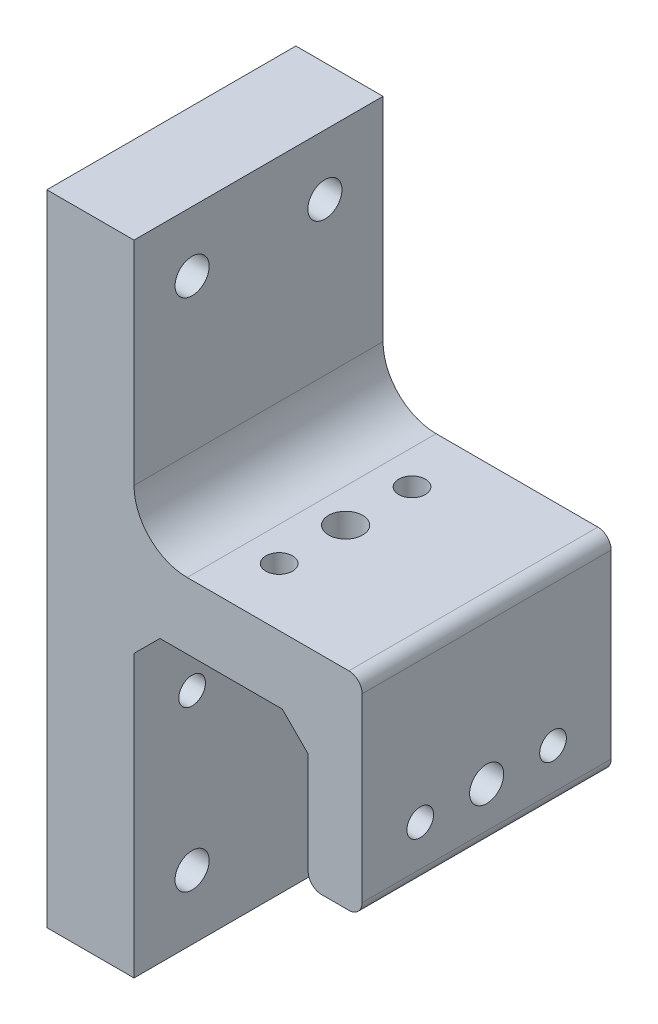
ISO-10303-21;
HEADER;
FILE_DESCRIPTION(('STEP AP214'),'2;1');
FILE_NAME('part.step','',(''),(''),'','','');
FILE_SCHEMA(('AUTOMOTIVE_DESIGN { 1 0 10303 214 1 1 1 1 }'));
ENDSEC;
DATA;
#1=APPLICATION_CONTEXT('core data for automotive mechanical design processes');
#2=APPLICATION_PROTOCOL_DEFINITION('international standard','automotive_design',2000,#1);
#3=PRODUCT_CONTEXT('',#1,'mechanical');
#4=PRODUCT('Part','Part','',(#3));
#5=PRODUCT_RELATED_PRODUCT_CATEGORY('part','',(#4));
#6=PRODUCT_DEFINITION_FORMATION('','',#4);
#7=PRODUCT_DEFINITION_CONTEXT('part definition',#1,'design');
#8=PRODUCT_DEFINITION('design','',#6,#7);
#9=PRODUCT_DEFINITION_SHAPE('','',#8);
#10=(LENGTH_UNIT() NAMED_UNIT(*) SI_UNIT(.MILLI.,.METRE.));
#11=(NAMED_UNIT(*) PLANE_ANGLE_UNIT() SI_UNIT($,.RADIAN.));
#12=(NAMED_UNIT(*) SI_UNIT($,.STERADIAN.) SOLID_ANGLE_UNIT());
#13=UNCERTAINTY_MEASURE_WITH_UNIT(LENGTH_MEASURE(1.E-05),#10,'distance_accuracy_value','');
#14=(GEOMETRIC_REPRESENTATION_CONTEXT(3) GLOBAL_UNCERTAINTY_ASSIGNED_CONTEXT((#13)) GLOBAL_UNIT_ASSIGNED_CONTEXT((#10,
#11,#12)) REPRESENTATION_CONTEXT('',''));
#15=CARTESIAN_POINT('',(0.,0.,0.));
#16=DIRECTION('',(0.,0.,1.));
#17=DIRECTION('',(1.,0.,0.));
#18=AXIS2_PLACEMENT_3D('',#15,#16,#17);
#19=CARTESIAN_POINT('',(0.,14.6812,0.));
#20=DIRECTION('',(0.,1.,0.));
#21=DIRECTION('',(-1.,0.,0.));
#22=AXIS2_PLACEMENT_3D('',#19,#20,#21);
#23=PLANE('',#22);
#24=CARTESIAN_POINT('',(0.,14.6812,-12.7));
#25=DIRECTION('',(0.,1.,0.));
#26=DIRECTION('',(-1.,0.,0.));
#27=AXIS2_PLACEMENT_3D('',#24,#25,#26);
#28=CIRCLE('',#27,2.5527);
#29=CARTESIAN_POINT('',(-2.5527,14.6812,-12.7));
#30=VERTEX_POINT('',#29);
#31=EDGE_CURVE('E269',#30,#30,#28,.T.);
#32=ORIENTED_EDGE('',*,*,#31,.F.);
#33=EDGE_LOOP('',(#32));
#34=FACE_BOUND('',#33,.T.);
#35=CARTESIAN_POINT('',(0.,14.6812,12.7));
#36=DIRECTION('',(0.,1.,0.));
#37=DIRECTION('',(-1.,0.,0.));
#38=AXIS2_PLACEMENT_3D('',#35,#36,#37);
#39=CIRCLE('',#38,2.5527);
#40=CARTESIAN_POINT('',(-2.5527,14.6812,12.7));
#41=VERTEX_POINT('',#40);
#42=EDGE_CURVE('E273',#41,#41,#39,.T.);
#43=ORIENTED_EDGE('',*,*,#42,.F.);
#44=EDGE_LOOP('',(#43));
#45=FACE_BOUND('',#44,.T.);
#46=CARTESIAN_POINT('',(0.,14.6812,0.));
#47=DIRECTION('',(0.,1.,0.));
#48=DIRECTION('',(-1.,0.,0.));
#49=AXIS2_PLACEMENT_3D('',#46,#47,#48);
#50=CIRCLE('',#49,3.2639);
#51=CARTESIAN_POINT('',(-3.2639,14.6812,0.));
#52=VERTEX_POINT('',#51);
#53=EDGE_CURVE('E244',#52,#52,#50,.T.);
#54=ORIENTED_EDGE('',*,*,#53,.F.);
#55=EDGE_LOOP('',(#54));
#56=FACE_BOUND('',#55,.T.);
#57=DIRECTION('',(1.,0.,0.));
#58=VECTOR('',#57,1.);
#59=CARTESIAN_POINT('',(-26.9748,14.6812,23.8125));
#60=LINE('',#59,#58);
#61=CARTESIAN_POINT('',(-6.49605,14.6812,23.8125));
#62=VERTEX_POINT('',#61);
#63=CARTESIAN_POINT('',(24.4348,14.6812,23.8125));
#64=VERTEX_POINT('',#63);
#65=EDGE_CURVE('E277',#62,#64,#60,.T.);
#66=ORIENTED_EDGE('',*,*,#65,.T.);
#67=DIRECTION('',(0.,0.,-1.));
#68=VECTOR('',#67,1.);
#69=CARTESIAN_POINT('',(24.4348,14.6812,0.));
#70=LINE('',#69,#68);
#71=CARTESIAN_POINT('',(24.4348,14.6812,-23.8125));
#72=VERTEX_POINT('',#71);
#73=EDGE_CURVE('E11',#64,#72,#70,.T.);
#74=ORIENTED_EDGE('',*,*,#73,.T.);
#75=DIRECTION('',(-1.,0.,0.));
#76=VECTOR('',#75,1.);
#77=CARTESIAN_POINT('',(26.9748,14.6812,-23.8125));
#78=LINE('',#77,#76);
#79=CARTESIAN_POINT('',(-6.49605,14.6812,-23.8125));
#80=VERTEX_POINT('',#79);
#81=EDGE_CURVE('E280',#72,#80,#78,.T.);
#82=ORIENTED_EDGE('',*,*,#81,.T.);
#83=DIRECTION('',(0.,0.,1.));
#84=VECTOR('',#83,1.);
#85=CARTESIAN_POINT('',(-6.49605,14.6812,0.));
#86=LINE('',#85,#84);
#87=EDGE_CURVE('E408',#80,#62,#86,.T.);
#88=ORIENTED_EDGE('',*,*,#87,.T.);
#89=EDGE_LOOP('',(#66,#74,#82,#88));
#90=FACE_BOUND('',#89,.T.);
#91=ADVANCED_FACE('F45',(#34,#45,#56,#90),#23,.T.);
#92=CARTESIAN_POINT('',(-16.65605,-24.9936,23.8125));
#93=DIRECTION('',(-1.,0.,0.));
#94=DIRECTION('',(0.,0.,1.));
#95=AXIS2_PLACEMENT_3D('',#92,#93,#94);
#96=PLANE('',#95);
#97=CARTESIAN_POINT('',(-16.65605,-44.45,-12.7));
#98=DIRECTION('',(-1.,0.,0.));
#99=DIRECTION('',(0.,0.,1.));
#100=AXIS2_PLACEMENT_3D('',#97,#98,#99);
#101=CIRCLE('',#100,3.2639);
#102=CARTESIAN_POINT('',(-16.65605,-44.45,-9.43609999999999));
#103=VERTEX_POINT('',#102);
#104=EDGE_CURVE('E1000',#103,#103,#101,.T.);
#105=ORIENTED_EDGE('',*,*,#104,.T.);
#106=EDGE_LOOP('',(#105));
#107=FACE_BOUND('',#106,.T.);
#108=CARTESIAN_POINT('',(-16.65605,-44.45,12.7));
#109=DIRECTION('',(-1.,0.,0.));
#110=DIRECTION('',(0.,0.,1.));
#111=AXIS2_PLACEMENT_3D('',#108,#109,#110);
#112=CIRCLE('',#111,3.26390000000001);
#113=CARTESIAN_POINT('',(-16.65605,-44.45,15.9639));
#114=VERTEX_POINT('',#113);
#115=EDGE_CURVE('E1010',#114,#114,#112,.T.);
#116=ORIENTED_EDGE('',*,*,#115,.T.);
#117=EDGE_LOOP('',(#116));
#118=FACE_BOUND('',#117,.T.);
#119=CARTESIAN_POINT('',(-16.65605,-14.6812,-12.7));
#120=DIRECTION('',(-1.,0.,0.));
#121=DIRECTION('',(0.,0.,1.));
#122=AXIS2_PLACEMENT_3D('',#119,#120,#121);
#123=CIRCLE('',#122,2.5527);
#124=CARTESIAN_POINT('',(-16.65605,-14.6812,-10.1473));
#125=VERTEX_POINT('',#124);
#126=EDGE_CURVE('E349',#125,#125,#123,.T.);
#127=ORIENTED_EDGE('',*,*,#126,.T.);
#128=EDGE_LOOP('',(#127));
#129=FACE_BOUND('',#128,.T.);
#130=DIRECTION('',(0.,0.,-1.));
#131=VECTOR('',#130,1.);
#132=CARTESIAN_POINT('',(-16.65605,-11.4173,23.8125));
#133=LINE('',#132,#131);
#134=CARTESIAN_POINT('',(-16.65605,-11.4173,3.2639));
#135=VERTEX_POINT('',#134);
#136=CARTESIAN_POINT('',(-16.65605,-11.4173,-3.2639));
#137=VERTEX_POINT('',#136);
#138=EDGE_CURVE('E316',#135,#137,#133,.T.);
#139=ORIENTED_EDGE('',*,*,#138,.T.);
#140=DIRECTION('',(0.,-1.,0.));
#141=VECTOR('',#140,1.);
#142=CARTESIAN_POINT('',(-16.65605,-24.9936,-3.2639));
#143=LINE('',#142,#141);
#144=CARTESIAN_POINT('',(-16.65605,-17.9451,-3.2639));
#145=VERTEX_POINT('',#144);
#146=EDGE_CURVE('E330',#137,#145,#143,.T.);
#147=ORIENTED_EDGE('',*,*,#146,.T.);
#148=DIRECTION('',(0.,0.,1.));
#149=VECTOR('',#148,1.);
#150=CARTESIAN_POINT('',(-16.65605,-17.9451,23.8125));
#151=LINE('',#150,#149);
#152=CARTESIAN_POINT('',(-16.65605,-17.9451,3.2639));
#153=VERTEX_POINT('',#152);
#154=EDGE_CURVE('E327',#145,#153,#151,.T.);
#155=ORIENTED_EDGE('',*,*,#154,.T.);
#156=DIRECTION('',(0.,1.,0.));
#157=VECTOR('',#156,1.);
#158=CARTESIAN_POINT('',(-16.65605,-24.9936,3.2639));
#159=LINE('',#158,#157);
#160=EDGE_CURVE('E193',#153,#135,#159,.T.);
#161=ORIENTED_EDGE('',*,*,#160,.T.);
#162=EDGE_LOOP('',(#139,#147,#155,#161));
#163=FACE_BOUND('',#162,.T.);
#164=CARTESIAN_POINT('',(-16.65605,-14.6812,12.7));
#165=DIRECTION('',(-1.,0.,0.));
#166=DIRECTION('',(0.,0.,1.));
#167=AXIS2_PLACEMENT_3D('',#164,#165,#166);
#168=CIRCLE('',#167,2.5527);
#169=CARTESIAN_POINT('',(-16.65605,-14.6812,15.2527));
#170=VERTEX_POINT('',#169);
#171=EDGE_CURVE('E337',#170,#170,#168,.T.);
#172=ORIENTED_EDGE('',*,*,#171,.T.);
#173=EDGE_LOOP('',(#172));
#174=FACE_BOUND('',#173,.T.);
#175=DIRECTION('',(0.,1.,0.));
#176=VECTOR('',#175,1.);
#177=CARTESIAN_POINT('',(-16.65605,-24.9936,23.8125));
#178=LINE('',#177,#176);
#179=CARTESIAN_POINT('',(-16.65605,-56.7436,23.8125));
#180=VERTEX_POINT('',#179);
#181=CARTESIAN_POINT('',(-16.65605,-2.97973749999999,23.8125));
#182=VERTEX_POINT('',#181);
#183=EDGE_CURVE('E377',#180,#182,#178,.T.);
#184=ORIENTED_EDGE('',*,*,#183,.F.);
#185=DIRECTION('',(0.,0.,-1.));
#186=VECTOR('',#185,1.);
#187=CARTESIAN_POINT('',(-16.65605,-56.7436,-23.8125));
#188=LINE('',#187,#186);
#189=CARTESIAN_POINT('',(-16.65605,-56.7436,-23.8125));
#190=VERTEX_POINT('',#189);
#191=EDGE_CURVE('E240',#180,#190,#188,.T.);
#192=ORIENTED_EDGE('',*,*,#191,.T.);
#193=DIRECTION('',(0.,1.,0.));
#194=VECTOR('',#193,1.);
#195=CARTESIAN_POINT('',(-16.65605,-24.9936,-23.8125));
#196=LINE('',#195,#194);
#197=CARTESIAN_POINT('',(-16.65605,-2.97973749999999,-23.8125));
#198=VERTEX_POINT('',#197);
#199=EDGE_CURVE('E353',#190,#198,#196,.T.);
#200=ORIENTED_EDGE('',*,*,#199,.T.);
#201=DIRECTION('',(0.,0.,-1.));
#202=VECTOR('',#201,1.);
#203=CARTESIAN_POINT('',(-16.65605,-2.97973749999999,23.8125));
#204=LINE('',#203,#202);
#205=EDGE_CURVE('E405',#182,#198,#204,.T.);
#206=ORIENTED_EDGE('',*,*,#205,.F.);
#207=EDGE_LOOP('',(#184,#192,#200,#206));
#208=FACE_BOUND('',#207,.T.);
#209=ADVANCED_FACE('F495',(#107,#118,#129,#163,#174,#208),#96,.F.);
#210=CARTESIAN_POINT('',(-16.65605,-2.97973749999999,23.8125));
#211=DIRECTION('',(-0.707106781186547,0.707106781186548,0.));
#212=DIRECTION('',(-0.707106781186548,-0.707106781186547,0.));
#213=AXIS2_PLACEMENT_3D('',#210,#211,#212);
#214=PLANE('',#213);
#215=ORIENTED_EDGE('',*,*,#205,.T.);
#216=DIRECTION('',(0.707106781186548,0.707106781186547,0.));
#217=VECTOR('',#216,1.);
#218=CARTESIAN_POINT('',(-16.65605,-2.97973749999999,-23.8125));
#219=LINE('',#218,#217);
#220=CARTESIAN_POINT('',(-11.6951125,1.98120000000001,-23.8125));
#221=VERTEX_POINT('',#220);
#222=EDGE_CURVE('E357',#198,#221,#219,.T.);
#223=ORIENTED_EDGE('',*,*,#222,.T.);
#224=DIRECTION('',(0.,0.,-1.));
#225=VECTOR('',#224,1.);
#226=CARTESIAN_POINT('',(-11.6951125,1.98120000000001,23.8125));
#227=LINE('',#226,#225);
#228=CARTESIAN_POINT('',(-11.6951125,1.98120000000001,23.8125));
#229=VERTEX_POINT('',#228);
#230=EDGE_CURVE('E402',#229,#221,#227,.T.);
#231=ORIENTED_EDGE('',*,*,#230,.F.);
#232=DIRECTION('',(0.707106781186548,0.707106781186547,0.));
#233=VECTOR('',#232,1.);
#234=CARTESIAN_POINT('',(-16.65605,-2.97973749999999,23.8125));
#235=LINE('',#234,#233);
#236=EDGE_CURVE('E380',#182,#229,#235,.T.);
#237=ORIENTED_EDGE('',*,*,#236,.F.);
#238=EDGE_LOOP('',(#215,#223,#231,#237));
#239=FACE_BOUND('',#238,.T.);
#240=ADVANCED_FACE('F498',(#239),#214,.F.);
#241=CARTESIAN_POINT('',(-11.6951125,1.98120000000001,23.8125));
#242=DIRECTION('',(0.,1.,0.));
#243=DIRECTION('',(0.,0.,1.));
#244=AXIS2_PLACEMENT_3D('',#241,#242,#243);
#245=PLANE('',#244);
#246=CARTESIAN_POINT('',(0.,1.98120000000001,0.));
#247=DIRECTION('',(0.,1.,0.));
#248=DIRECTION('',(0.,0.,1.));
#249=AXIS2_PLACEMENT_3D('',#246,#247,#248);
#250=CIRCLE('',#249,3.2639);
#251=CARTESIAN_POINT('',(0.,1.98120000000001,3.2639));
#252=VERTEX_POINT('',#251);
#253=EDGE_CURVE('E302',#252,#252,#250,.T.);
#254=ORIENTED_EDGE('',*,*,#253,.T.);
#255=EDGE_LOOP('',(#254));
#256=FACE_BOUND('',#255,.T.);
#257=CARTESIAN_POINT('',(0.,1.98120000000001,-12.7));
#258=DIRECTION('',(0.,1.,0.));
#259=DIRECTION('',(-1.,0.,0.));
#260=AXIS2_PLACEMENT_3D('',#257,#258,#259);
#261=CIRCLE('',#260,2.5527);
#262=CARTESIAN_POINT('',(-2.5527,1.98120000000001,-12.7));
#263=VERTEX_POINT('',#262);
#264=EDGE_CURVE('E307',#263,#263,#261,.T.);
#265=ORIENTED_EDGE('',*,*,#264,.T.);
#266=EDGE_LOOP('',(#265));
#267=FACE_BOUND('',#266,.T.);
#268=CARTESIAN_POINT('',(0.,1.98120000000001,12.7));
#269=DIRECTION('',(0.,1.,0.));
#270=DIRECTION('',(-1.,0.,0.));
#271=AXIS2_PLACEMENT_3D('',#268,#269,#270);
#272=CIRCLE('',#271,2.5527);
#273=CARTESIAN_POINT('',(-2.5527,1.98120000000001,12.7));
#274=VERTEX_POINT('',#273);
#275=EDGE_CURVE('E306',#274,#274,#272,.T.);
#276=ORIENTED_EDGE('',*,*,#275,.T.);
#277=EDGE_LOOP('',(#276));
#278=FACE_BOUND('',#277,.T.);
#279=ORIENTED_EDGE('',*,*,#230,.T.);
#280=DIRECTION('',(1.,0.,0.));
#281=VECTOR('',#280,1.);
#282=CARTESIAN_POINT('',(-11.6951125,1.98120000000001,-23.8125));
#283=LINE('',#282,#281);
#284=CARTESIAN_POINT('',(11.6951125,1.98120000000001,-23.8125));
#285=VERTEX_POINT('',#284);
#286=EDGE_CURVE('E361',#221,#285,#283,.T.);
#287=ORIENTED_EDGE('',*,*,#286,.T.);
#288=DIRECTION('',(0.,0.,-1.));
#289=VECTOR('',#288,1.);
#290=CARTESIAN_POINT('',(11.6951125,1.98120000000001,23.8125));
#291=LINE('',#290,#289);
#292=CARTESIAN_POINT('',(11.6951125,1.98120000000001,23.8125));
#293=VERTEX_POINT('',#292);
#294=EDGE_CURVE('E399',#293,#285,#291,.T.);
#295=ORIENTED_EDGE('',*,*,#294,.F.);
#296=DIRECTION('',(1.,0.,0.));
#297=VECTOR('',#296,1.);
#298=CARTESIAN_POINT('',(-11.6951125,1.98120000000001,23.8125));
#299=LINE('',#298,#297);
#300=EDGE_CURVE('E383',#229,#293,#299,.T.);
#301=ORIENTED_EDGE('',*,*,#300,.F.);
#302=EDGE_LOOP('',(#279,#287,#295,#301));
#303=FACE_BOUND('',#302,.T.);
#304=ADVANCED_FACE('F503',(#256,#267,#278,#303),#245,.F.);
#305=CARTESIAN_POINT('',(11.6951125,1.98120000000001,23.8125));
#306=DIRECTION('',(0.707106781186548,0.707106781186547,0.));
#307=DIRECTION('',(-0.707106781186547,0.707106781186548,0.));
#308=AXIS2_PLACEMENT_3D('',#305,#306,#307);
#309=PLANE('',#308);
#310=ORIENTED_EDGE('',*,*,#294,.T.);
#311=DIRECTION('',(0.707106781186547,-0.707106781186548,0.));
#312=VECTOR('',#311,1.);
#313=CARTESIAN_POINT('',(11.6951125,1.98120000000001,-23.8125));
#314=LINE('',#313,#312);
#315=CARTESIAN_POINT('',(16.65605,-2.97973749999998,-23.8125));
#316=VERTEX_POINT('',#315);
#317=EDGE_CURVE('E365',#285,#316,#314,.T.);
#318=ORIENTED_EDGE('',*,*,#317,.T.);
#319=DIRECTION('',(0.,0.,-1.));
#320=VECTOR('',#319,1.);
#321=CARTESIAN_POINT('',(16.65605,-2.97973749999998,23.8125));
#322=LINE('',#321,#320);
#323=CARTESIAN_POINT('',(16.65605,-2.97973749999998,23.8125));
#324=VERTEX_POINT('',#323);
#325=EDGE_CURVE('E396',#324,#316,#322,.T.);
#326=ORIENTED_EDGE('',*,*,#325,.F.);
#327=DIRECTION('',(0.707106781186547,-0.707106781186548,0.));
#328=VECTOR('',#327,1.);
#329=CARTESIAN_POINT('',(11.6951125,1.98120000000001,23.8125));
#330=LINE('',#329,#328);
#331=EDGE_CURVE('E386',#293,#324,#330,.T.);
#332=ORIENTED_EDGE('',*,*,#331,.F.);
#333=EDGE_LOOP('',(#310,#318,#326,#332));
#334=FACE_BOUND('',#333,.T.);
#335=ADVANCED_FACE('F509',(#334),#309,.F.);
#336=CARTESIAN_POINT('',(16.65605,-2.97973749999998,23.8125));
#337=DIRECTION('',(1.,0.,0.));
#338=DIRECTION('',(0.,1.,0.));
#339=AXIS2_PLACEMENT_3D('',#336,#337,#338);
#340=PLANE('',#339);
#341=CARTESIAN_POINT('',(16.65605,-14.6812,-12.7));
#342=DIRECTION('',(1.,0.,0.));
#343=DIRECTION('',(0.,1.,0.));
#344=AXIS2_PLACEMENT_3D('',#341,#342,#343);
#345=CIRCLE('',#344,2.5527);
#346=CARTESIAN_POINT('',(16.65605,-12.1285,-12.7));
#347=VERTEX_POINT('',#346);
#348=EDGE_CURVE('E345',#347,#347,#345,.T.);
#349=ORIENTED_EDGE('',*,*,#348,.T.);
#350=EDGE_LOOP('',(#349));
#351=FACE_BOUND('',#350,.T.);
#352=CARTESIAN_POINT('',(16.65605,-14.6812,0.));
#353=DIRECTION('',(1.,0.,0.));
#354=DIRECTION('',(0.,1.,0.));
#355=AXIS2_PLACEMENT_3D('',#352,#353,#354);
#356=CIRCLE('',#355,3.2639);
#357=CARTESIAN_POINT('',(16.65605,-11.4173,0.));
#358=VERTEX_POINT('',#357);
#359=EDGE_CURVE('E341',#358,#358,#356,.T.);
#360=ORIENTED_EDGE('',*,*,#359,.T.);
#361=EDGE_LOOP('',(#360));
#362=FACE_BOUND('',#361,.T.);
#363=CARTESIAN_POINT('',(16.65605,-14.6812,12.7));
#364=DIRECTION('',(1.,0.,0.));
#365=DIRECTION('',(0.,1.,0.));
#366=AXIS2_PLACEMENT_3D('',#363,#364,#365);
#367=CIRCLE('',#366,2.5527);
#368=CARTESIAN_POINT('',(16.65605,-12.1285,12.7));
#369=VERTEX_POINT('',#368);
#370=EDGE_CURVE('E333',#369,#369,#367,.T.);
#371=ORIENTED_EDGE('',*,*,#370,.T.);
#372=EDGE_LOOP('',(#371));
#373=FACE_BOUND('',#372,.T.);
#374=DIRECTION('',(0.,-1.,0.));
#375=VECTOR('',#374,1.);
#376=CARTESIAN_POINT('',(16.65605,-2.97973749999998,-23.8125));
#377=LINE('',#376,#375);
#378=CARTESIAN_POINT('',(16.65605,-22.4536,-23.8125));
#379=VERTEX_POINT('',#378);
#380=EDGE_CURVE('E369',#316,#379,#377,.T.);
#381=ORIENTED_EDGE('',*,*,#380,.T.);
#382=DIRECTION('',(0.,0.,-1.));
#383=VECTOR('',#382,1.);
#384=CARTESIAN_POINT('',(16.65605,-22.4536,23.8125));
#385=LINE('',#384,#383);
#386=CARTESIAN_POINT('',(16.65605,-22.4536,23.8125));
#387=VERTEX_POINT('',#386);
#388=EDGE_CURVE('E438',#379,#387,#385,.F.);
#389=ORIENTED_EDGE('',*,*,#388,.T.);
#390=DIRECTION('',(0.,-1.,0.));
#391=VECTOR('',#390,1.);
#392=CARTESIAN_POINT('',(16.65605,-2.97973749999998,23.8125));
#393=LINE('',#392,#391);
#394=EDGE_CURVE('E389',#324,#387,#393,.T.);
#395=ORIENTED_EDGE('',*,*,#394,.F.);
#396=ORIENTED_EDGE('',*,*,#325,.T.);
#397=EDGE_LOOP('',(#381,#389,#395,#396));
#398=FACE_BOUND('',#397,.T.);
#399=ADVANCED_FACE('F513',(#351,#362,#373,#398),#340,.F.);
#400=CARTESIAN_POINT('',(16.65605,-24.9936,23.8125));
#401=DIRECTION('',(0.,1.,0.));
#402=DIRECTION('',(-1.,0.,0.));
#403=AXIS2_PLACEMENT_3D('',#400,#401,#402);
#404=PLANE('',#403);
#405=DIRECTION('',(1.,0.,0.));
#406=VECTOR('',#405,1.);
#407=CARTESIAN_POINT('',(16.65605,-24.9936,23.8125));
#408=LINE('',#407,#406);
#409=CARTESIAN_POINT('',(19.19605,-24.9936,23.8125));
#410=VERTEX_POINT('',#409);
#411=CARTESIAN_POINT('',(24.4348,-24.9936,23.8125));
#412=VERTEX_POINT('',#411);
#413=EDGE_CURVE('E393',#410,#412,#408,.T.);
#414=ORIENTED_EDGE('',*,*,#413,.F.);
#415=DIRECTION('',(0.,0.,-1.));
#416=VECTOR('',#415,1.);
#417=CARTESIAN_POINT('',(19.19605,-24.9936,23.8125));
#418=LINE('',#417,#416);
#419=CARTESIAN_POINT('',(19.19605,-24.9936,-23.8125));
#420=VERTEX_POINT('',#419);
#421=EDGE_CURVE('E425',#410,#420,#418,.T.);
#422=ORIENTED_EDGE('',*,*,#421,.T.);
#423=DIRECTION('',(1.,0.,0.));
#424=VECTOR('',#423,1.);
#425=CARTESIAN_POINT('',(16.65605,-24.9936,-23.8125));
#426=LINE('',#425,#424);
#427=CARTESIAN_POINT('',(24.4348,-24.9936,-23.8125));
#428=VERTEX_POINT('',#427);
#429=EDGE_CURVE('E373',#420,#428,#426,.T.);
#430=ORIENTED_EDGE('',*,*,#429,.T.);
#431=DIRECTION('',(0.,0.,-1.));
#432=VECTOR('',#431,1.);
#433=CARTESIAN_POINT('',(24.4348,-24.9936,23.8125));
#434=LINE('',#433,#432);
#435=EDGE_CURVE('E422',#428,#412,#434,.F.);
#436=ORIENTED_EDGE('',*,*,#435,.T.);
#437=EDGE_LOOP('',(#414,#422,#430,#436));
#438=FACE_BOUND('',#437,.T.);
#439=ADVANCED_FACE('F520',(#438),#404,.F.);
#440=CARTESIAN_POINT('',(0.,0.,23.8125));
#441=DIRECTION('',(0.,0.,1.));
#442=DIRECTION('',(1.,0.,0.));
#443=AXIS2_PLACEMENT_3D('',#440,#441,#442);
#444=PLANE('',#443);
#445=ORIENTED_EDGE('',*,*,#394,.T.);
#446=CARTESIAN_POINT('',(19.19605,-22.4536,23.8125));
#447=DIRECTION('',(0.,0.,1.));
#448=DIRECTION('',(1.,0.,0.));
#449=AXIS2_PLACEMENT_3D('',#446,#447,#448);
#450=CIRCLE('',#449,2.54);
#451=EDGE_CURVE('E445',#387,#410,#450,.T.);
#452=ORIENTED_EDGE('',*,*,#451,.T.);
#453=ORIENTED_EDGE('',*,*,#413,.T.);
#454=CARTESIAN_POINT('',(24.4348,-22.4536,23.8125));
#455=DIRECTION('',(0.,0.,1.));
#456=DIRECTION('',(1.,0.,0.));
#457=AXIS2_PLACEMENT_3D('',#454,#455,#456);
#458=CIRCLE('',#457,2.54);
#459=CARTESIAN_POINT('',(26.9748,-22.4536,23.8125));
#460=VERTEX_POINT('',#459);
#461=EDGE_CURVE('E67',#412,#460,#458,.T.);
#462=ORIENTED_EDGE('',*,*,#461,.T.);
#463=DIRECTION('',(0.,-1.,0.));
#464=VECTOR('',#463,1.);
#465=CARTESIAN_POINT('',(26.9748,8.33120000000001,23.8125));
#466=LINE('',#465,#464);
#467=CARTESIAN_POINT('',(26.9748,12.1412,23.8125));
#468=VERTEX_POINT('',#467);
#469=EDGE_CURVE('E295',#468,#460,#466,.T.);
#470=ORIENTED_EDGE('',*,*,#469,.F.);
#471=CARTESIAN_POINT('',(24.4348,12.1412,23.8125));
#472=DIRECTION('',(0.,0.,1.));
#473=DIRECTION('',(1.,0.,0.));
#474=AXIS2_PLACEMENT_3D('',#471,#472,#473);
#475=CIRCLE('',#474,2.54);
#476=EDGE_CURVE('E61',#468,#64,#475,.T.);
#477=ORIENTED_EDGE('',*,*,#476,.T.);
#478=ORIENTED_EDGE('',*,*,#65,.F.);
#479=CARTESIAN_POINT('',(-6.49605,24.8412,23.8125));
#480=DIRECTION('',(0.,0.,1.));
#481=DIRECTION('',(1.,0.,0.));
#482=AXIS2_PLACEMENT_3D('',#479,#480,#481);
#483=CIRCLE('',#482,10.16);
#484=CARTESIAN_POINT('',(-16.65605,24.8412,23.8125));
#485=VERTEX_POINT('',#484);
#486=EDGE_CURVE('E415',#62,#485,#483,.F.);
#487=ORIENTED_EDGE('',*,*,#486,.T.);
#488=DIRECTION('',(0.,-1.,0.));
#489=VECTOR('',#488,1.);
#490=CARTESIAN_POINT('',(-16.65605,14.6812,23.8125));
#491=LINE('',#490,#489);
#492=CARTESIAN_POINT('',(-16.65605,65.4812,23.8125));
#493=VERTEX_POINT('',#492);
#494=EDGE_CURVE('E246',#493,#485,#491,.T.);
#495=ORIENTED_EDGE('',*,*,#494,.F.);
#496=DIRECTION('',(-1.,0.,0.));
#497=VECTOR('',#496,1.);
#498=CARTESIAN_POINT('',(114.519566484315,65.4812,23.8125));
#499=LINE('',#498,#497);
#500=CARTESIAN_POINT('',(-33.3248,65.4812,23.8125));
#501=VERTEX_POINT('',#500);
#502=EDGE_CURVE('E258',#493,#501,#499,.T.);
#503=ORIENTED_EDGE('',*,*,#502,.T.);
#504=DIRECTION('',(0.,1.,0.));
#505=VECTOR('',#504,1.);
#506=CARTESIAN_POINT('',(-33.3248,-24.9936,23.8125));
#507=LINE('',#506,#505);
#508=CARTESIAN_POINT('',(-33.3248,-56.7436,23.8125));
#509=VERTEX_POINT('',#508);
#510=EDGE_CURVE('E231',#509,#501,#507,.T.);
#511=ORIENTED_EDGE('',*,*,#510,.F.);
#512=DIRECTION('',(-1.,0.,0.));
#513=VECTOR('',#512,1.);
#514=CARTESIAN_POINT('',(114.519566484315,-56.7436,23.8125));
#515=LINE('',#514,#513);
#516=EDGE_CURVE('E261',#180,#509,#515,.T.);
#517=ORIENTED_EDGE('',*,*,#516,.F.);
#518=ORIENTED_EDGE('',*,*,#183,.T.);
#519=ORIENTED_EDGE('',*,*,#236,.T.);
#520=ORIENTED_EDGE('',*,*,#300,.T.);
#521=ORIENTED_EDGE('',*,*,#331,.T.);
#522=EDGE_LOOP('',(#445,#452,#453,#462,#470,#477,#478,#487,#495,#503,#511,#517,#518,#519,#520,#521));
#523=FACE_BOUND('',#522,.T.);
#524=ADVANCED_FACE('F467',(#523),#444,.T.);
#525=CARTESIAN_POINT('',(0.,0.,-23.8125));
#526=DIRECTION('',(0.,0.,1.));
#527=DIRECTION('',(1.,0.,0.));
#528=AXIS2_PLACEMENT_3D('',#525,#526,#527);
#529=PLANE('',#528);
#530=ORIENTED_EDGE('',*,*,#429,.F.);
#531=CARTESIAN_POINT('',(19.19605,-22.4536,-23.8125));
#532=DIRECTION('',(0.,0.,1.));
#533=DIRECTION('',(1.,0.,0.));
#534=AXIS2_PLACEMENT_3D('',#531,#532,#533);
#535=CIRCLE('',#534,2.54);
#536=EDGE_CURVE('E435',#420,#379,#535,.F.);
#537=ORIENTED_EDGE('',*,*,#536,.T.);
#538=ORIENTED_EDGE('',*,*,#380,.F.);
#539=ORIENTED_EDGE('',*,*,#317,.F.);
#540=ORIENTED_EDGE('',*,*,#286,.F.);
#541=ORIENTED_EDGE('',*,*,#222,.F.);
#542=ORIENTED_EDGE('',*,*,#199,.F.);
#543=DIRECTION('',(-1.,0.,0.));
#544=VECTOR('',#543,1.);
#545=CARTESIAN_POINT('',(114.519566484315,-56.7436,-23.8125));
#546=LINE('',#545,#544);
#547=CARTESIAN_POINT('',(-33.3248,-56.7436,-23.8125));
#548=VERTEX_POINT('',#547);
#549=EDGE_CURVE('E239',#190,#548,#546,.T.);
#550=ORIENTED_EDGE('',*,*,#549,.T.);
#551=DIRECTION('',(0.,-1.,0.));
#552=VECTOR('',#551,1.);
#553=CARTESIAN_POINT('',(-33.3248,14.6812,-23.8125));
#554=LINE('',#553,#552);
#555=CARTESIAN_POINT('',(-33.3248,65.4812,-23.8125));
#556=VERTEX_POINT('',#555);
#557=EDGE_CURVE('E223',#556,#548,#554,.T.);
#558=ORIENTED_EDGE('',*,*,#557,.F.);
#559=DIRECTION('',(-1.,0.,0.));
#560=VECTOR('',#559,1.);
#561=CARTESIAN_POINT('',(114.519566484315,65.4812,-23.8125));
#562=LINE('',#561,#560);
#563=CARTESIAN_POINT('',(-16.65605,65.4812,-23.8125));
#564=VERTEX_POINT('',#563);
#565=EDGE_CURVE('E251',#564,#556,#562,.T.);
#566=ORIENTED_EDGE('',*,*,#565,.F.);
#567=DIRECTION('',(0.,1.,0.));
#568=VECTOR('',#567,1.);
#569=CARTESIAN_POINT('',(-16.65605,14.6812,-23.8125));
#570=LINE('',#569,#568);
#571=CARTESIAN_POINT('',(-16.65605,24.8412,-23.8125));
#572=VERTEX_POINT('',#571);
#573=EDGE_CURVE('E245',#572,#564,#570,.T.);
#574=ORIENTED_EDGE('',*,*,#573,.F.);
#575=CARTESIAN_POINT('',(-6.49605,24.8412,-23.8125));
#576=DIRECTION('',(0.,0.,1.));
#577=DIRECTION('',(1.,0.,0.));
#578=AXIS2_PLACEMENT_3D('',#575,#576,#577);
#579=CIRCLE('',#578,10.16);
#580=EDGE_CURVE('E418',#572,#80,#579,.T.);
#581=ORIENTED_EDGE('',*,*,#580,.T.);
#582=ORIENTED_EDGE('',*,*,#81,.F.);
#583=CARTESIAN_POINT('',(24.4348,12.1412,-23.8125));
#584=DIRECTION('',(0.,0.,1.));
#585=DIRECTION('',(1.,0.,0.));
#586=AXIS2_PLACEMENT_3D('',#583,#584,#585);
#587=CIRCLE('',#586,2.54);
#588=CARTESIAN_POINT('',(26.9748,12.1412,-23.8125));
#589=VERTEX_POINT('',#588);
#590=EDGE_CURVE('E429',#72,#589,#587,.F.);
#591=ORIENTED_EDGE('',*,*,#590,.T.);
#592=DIRECTION('',(0.,1.,0.));
#593=VECTOR('',#592,1.);
#594=CARTESIAN_POINT('',(26.9748,-24.9936,-23.8125));
#595=LINE('',#594,#593);
#596=CARTESIAN_POINT('',(26.9748,-22.4536,-23.8125));
#597=VERTEX_POINT('',#596);
#598=EDGE_CURVE('E298',#597,#589,#595,.T.);
#599=ORIENTED_EDGE('',*,*,#598,.F.);
#600=CARTESIAN_POINT('',(24.4348,-22.4536,-23.8125));
#601=DIRECTION('',(0.,0.,1.));
#602=DIRECTION('',(1.,0.,0.));
#603=AXIS2_PLACEMENT_3D('',#600,#601,#602);
#604=CIRCLE('',#603,2.54);
#605=EDGE_CURVE('E432',#597,#428,#604,.F.);
#606=ORIENTED_EDGE('',*,*,#605,.T.);
#607=EDGE_LOOP('',(#530,#537,#538,#539,#540,#541,#542,#550,#558,#566,#574,#581,#582,#591,#599,#606));
#608=FACE_BOUND('',#607,.T.);
#609=ADVANCED_FACE('F461',(#608),#529,.F.);
#610=CARTESIAN_POINT('',(-20.6248,-14.6812,12.7));
#611=DIRECTION('',(1.,0.,0.));
#612=DIRECTION('',(0.,0.,-1.));
#613=AXIS2_PLACEMENT_3D('',#610,#611,#612);
#614=CYLINDRICAL_SURFACE('',#613,2.5527);
#615=ORIENTED_EDGE('',*,*,#370,.F.);
#616=EDGE_LOOP('',(#615));
#617=FACE_BOUND('',#616,.T.);
#618=CARTESIAN_POINT('',(26.9748,-14.6812,12.7));
#619=DIRECTION('',(1.,0.,0.));
#620=DIRECTION('',(0.,0.,-1.));
#621=AXIS2_PLACEMENT_3D('',#618,#619,#620);
#622=CIRCLE('',#621,2.5527);
#623=CARTESIAN_POINT('',(26.9748,-14.6812,10.1473));
#624=VERTEX_POINT('',#623);
#625=EDGE_CURVE('E291',#624,#624,#622,.T.);
#626=ORIENTED_EDGE('',*,*,#625,.T.);
#627=EDGE_LOOP('',(#626));
#628=FACE_BOUND('',#627,.T.);
#629=ADVANCED_FACE('F575',(#617,#628),#614,.F.);
#630=CARTESIAN_POINT('',(-20.6248,-14.6812,0.));
#631=DIRECTION('',(1.,0.,0.));
#632=DIRECTION('',(0.,0.,-1.));
#633=AXIS2_PLACEMENT_3D('',#630,#631,#632);
#634=CYLINDRICAL_SURFACE('',#633,3.2639);
#635=ORIENTED_EDGE('',*,*,#359,.F.);
#636=EDGE_LOOP('',(#635));
#637=FACE_BOUND('',#636,.T.);
#638=CARTESIAN_POINT('',(26.9748,-14.6812,0.));
#639=DIRECTION('',(1.,0.,0.));
#640=DIRECTION('',(0.,0.,-1.));
#641=AXIS2_PLACEMENT_3D('',#638,#639,#640);
#642=CIRCLE('',#641,3.2639);
#643=CARTESIAN_POINT('',(26.9748,-14.6812,-3.2639));
#644=VERTEX_POINT('',#643);
#645=EDGE_CURVE('E287',#644,#644,#642,.T.);
#646=ORIENTED_EDGE('',*,*,#645,.T.);
#647=EDGE_LOOP('',(#646));
#648=FACE_BOUND('',#647,.T.);
#649=ADVANCED_FACE('F571',(#637,#648),#634,.F.);
#650=CARTESIAN_POINT('',(-20.6248,-14.6812,-12.7));
#651=DIRECTION('',(1.,0.,0.));
#652=DIRECTION('',(0.,0.,-1.));
#653=AXIS2_PLACEMENT_3D('',#650,#651,#652);
#654=CYLINDRICAL_SURFACE('',#653,2.5527);
#655=ORIENTED_EDGE('',*,*,#348,.F.);
#656=EDGE_LOOP('',(#655));
#657=FACE_BOUND('',#656,.T.);
#658=CARTESIAN_POINT('',(26.9748,-14.6812,-12.7));
#659=DIRECTION('',(1.,0.,0.));
#660=DIRECTION('',(0.,0.,-1.));
#661=AXIS2_PLACEMENT_3D('',#658,#659,#660);
#662=CIRCLE('',#661,2.5527);
#663=CARTESIAN_POINT('',(26.9748,-14.6812,-15.2527));
#664=VERTEX_POINT('',#663);
#665=EDGE_CURVE('E283',#664,#664,#662,.T.);
#666=ORIENTED_EDGE('',*,*,#665,.T.);
#667=EDGE_LOOP('',(#666));
#668=FACE_BOUND('',#667,.T.);
#669=ADVANCED_FACE('F574',(#657,#668),#654,.F.);
#670=ORIENTED_EDGE('',*,*,#171,.F.);
#671=EDGE_LOOP('',(#670));
#672=FACE_BOUND('',#671,.T.);
#673=CARTESIAN_POINT('',(-33.3248,-14.6812,12.7));
#674=DIRECTION('',(-1.,0.,0.));
#675=DIRECTION('',(0.,0.,1.));
#676=AXIS2_PLACEMENT_3D('',#673,#674,#675);
#677=CIRCLE('',#676,2.5527);
#678=CARTESIAN_POINT('',(-33.3248,-14.6812,15.2527));
#679=VERTEX_POINT('',#678);
#680=EDGE_CURVE('E208',#679,#679,#677,.T.);
#681=ORIENTED_EDGE('',*,*,#680,.T.);
#682=EDGE_LOOP('',(#681));
#683=FACE_BOUND('',#682,.T.);
#684=ADVANCED_FACE('F579',(#672,#683),#614,.F.);
#685=ORIENTED_EDGE('',*,*,#126,.F.);
#686=EDGE_LOOP('',(#685));
#687=FACE_BOUND('',#686,.T.);
#688=CARTESIAN_POINT('',(-33.3248,-14.6812,-12.7));
#689=DIRECTION('',(-1.,0.,0.));
#690=DIRECTION('',(0.,0.,1.));
#691=AXIS2_PLACEMENT_3D('',#688,#689,#690);
#692=CIRCLE('',#691,2.5527);
#693=CARTESIAN_POINT('',(-33.3248,-14.6812,-10.1473));
#694=VERTEX_POINT('',#693);
#695=EDGE_CURVE('E1002',#694,#694,#692,.T.);
#696=ORIENTED_EDGE('',*,*,#695,.T.);
#697=EDGE_LOOP('',(#696));
#698=FACE_BOUND('',#697,.T.);
#699=ADVANCED_FACE('F569',(#687,#698),#654,.F.);
#700=CARTESIAN_POINT('',(-20.6248,-17.9451,-3.2639));
#701=DIRECTION('',(0.,0.,-1.));
#702=DIRECTION('',(-1.,0.,0.));
#703=AXIS2_PLACEMENT_3D('',#700,#701,#702);
#704=PLANE('',#703);
#705=DIRECTION('',(1.,0.,0.));
#706=VECTOR('',#705,1.);
#707=CARTESIAN_POINT('',(-20.6248,-11.4173,-3.2639));
#708=LINE('',#707,#706);
#709=CARTESIAN_POINT('',(-33.3248,-11.4173,-3.2639));
#710=VERTEX_POINT('',#709);
#711=EDGE_CURVE('E311',#710,#137,#708,.T.);
#712=ORIENTED_EDGE('',*,*,#711,.F.);
#713=DIRECTION('',(0.,-1.,0.));
#714=VECTOR('',#713,1.);
#715=CARTESIAN_POINT('',(-33.3248,-11.4173,-3.2639));
#716=LINE('',#715,#714);
#717=CARTESIAN_POINT('',(-33.3248,-17.9451,-3.2639));
#718=VERTEX_POINT('',#717);
#719=EDGE_CURVE('E217',#710,#718,#716,.T.);
#720=ORIENTED_EDGE('',*,*,#719,.T.);
#721=DIRECTION('',(1.,0.,0.));
#722=VECTOR('',#721,1.);
#723=CARTESIAN_POINT('',(-20.6248,-17.9451,-3.2639));
#724=LINE('',#723,#722);
#725=EDGE_CURVE('E197',#718,#145,#724,.T.);
#726=ORIENTED_EDGE('',*,*,#725,.T.);
#727=ORIENTED_EDGE('',*,*,#146,.F.);
#728=EDGE_LOOP('',(#712,#720,#726,#727));
#729=FACE_BOUND('',#728,.T.);
#730=ADVANCED_FACE('F561',(#729),#704,.F.);
#731=CARTESIAN_POINT('',(-20.6248,-17.9451,3.2639));
#732=DIRECTION('',(0.,-1.,0.));
#733=DIRECTION('',(0.,0.,-1.));
#734=AXIS2_PLACEMENT_3D('',#731,#732,#733);
#735=PLANE('',#734);
#736=ORIENTED_EDGE('',*,*,#725,.F.);
#737=DIRECTION('',(0.,0.,1.));
#738=VECTOR('',#737,1.);
#739=CARTESIAN_POINT('',(-33.3248,-17.9451,-3.2639));
#740=LINE('',#739,#738);
#741=CARTESIAN_POINT('',(-33.3248,-17.9451,3.2639));
#742=VERTEX_POINT('',#741);
#743=EDGE_CURVE('E201',#718,#742,#740,.T.);
#744=ORIENTED_EDGE('',*,*,#743,.T.);
#745=DIRECTION('',(1.,0.,0.));
#746=VECTOR('',#745,1.);
#747=CARTESIAN_POINT('',(-20.6248,-17.9451,3.2639));
#748=LINE('',#747,#746);
#749=EDGE_CURVE('E186',#742,#153,#748,.T.);
#750=ORIENTED_EDGE('',*,*,#749,.T.);
#751=ORIENTED_EDGE('',*,*,#154,.F.);
#752=EDGE_LOOP('',(#736,#744,#750,#751));
#753=FACE_BOUND('',#752,.T.);
#754=ADVANCED_FACE('F202',(#753),#735,.F.);
#755=CARTESIAN_POINT('',(-20.6248,-17.9451,3.2639));
#756=DIRECTION('',(0.,0.,1.));
#757=DIRECTION('',(0.,-1.,0.));
#758=AXIS2_PLACEMENT_3D('',#755,#756,#757);
#759=PLANE('',#758);
#760=ORIENTED_EDGE('',*,*,#749,.F.);
#761=DIRECTION('',(0.,1.,0.));
#762=VECTOR('',#761,1.);
#763=CARTESIAN_POINT('',(-33.3248,-17.9451,3.2639));
#764=LINE('',#763,#762);
#765=CARTESIAN_POINT('',(-33.3248,-11.4173,3.2639));
#766=VERTEX_POINT('',#765);
#767=EDGE_CURVE('E191',#742,#766,#764,.T.);
#768=ORIENTED_EDGE('',*,*,#767,.T.);
#769=DIRECTION('',(1.,0.,0.));
#770=VECTOR('',#769,1.);
#771=CARTESIAN_POINT('',(-20.6248,-11.4173,3.2639));
#772=LINE('',#771,#770);
#773=EDGE_CURVE('E198',#766,#135,#772,.T.);
#774=ORIENTED_EDGE('',*,*,#773,.T.);
#775=ORIENTED_EDGE('',*,*,#160,.F.);
#776=EDGE_LOOP('',(#760,#768,#774,#775));
#777=FACE_BOUND('',#776,.T.);
#778=ADVANCED_FACE('F188',(#777),#759,.F.);
#779=CARTESIAN_POINT('',(-20.6248,-11.4173,3.2639));
#780=DIRECTION('',(0.,1.,0.));
#781=DIRECTION('',(0.,0.,1.));
#782=AXIS2_PLACEMENT_3D('',#779,#780,#781);
#783=PLANE('',#782);
#784=ORIENTED_EDGE('',*,*,#773,.F.);
#785=DIRECTION('',(0.,0.,-1.));
#786=VECTOR('',#785,1.);
#787=CARTESIAN_POINT('',(-33.3248,-11.4173,3.2639));
#788=LINE('',#787,#786);
#789=EDGE_CURVE('E213',#766,#710,#788,.T.);
#790=ORIENTED_EDGE('',*,*,#789,.T.);
#791=ORIENTED_EDGE('',*,*,#711,.T.);
#792=ORIENTED_EDGE('',*,*,#138,.F.);
#793=EDGE_LOOP('',(#784,#790,#791,#792));
#794=FACE_BOUND('',#793,.T.);
#795=ADVANCED_FACE('F557',(#794),#783,.F.);
#796=CARTESIAN_POINT('',(0.,1.98120000000001,12.7));
#797=DIRECTION('',(0.,1.,0.));
#798=DIRECTION('',(-1.,0.,0.));
#799=AXIS2_PLACEMENT_3D('',#796,#797,#798);
#800=CYLINDRICAL_SURFACE('',#799,2.5527);
#801=ORIENTED_EDGE('',*,*,#275,.F.);
#802=EDGE_LOOP('',(#801));
#803=FACE_BOUND('',#802,.T.);
#804=ORIENTED_EDGE('',*,*,#42,.T.);
#805=EDGE_LOOP('',(#804));
#806=FACE_BOUND('',#805,.T.);
#807=ADVANCED_FACE('F553',(#803,#806),#800,.F.);
#808=CARTESIAN_POINT('',(0.,1.98120000000001,-12.7));
#809=DIRECTION('',(0.,1.,0.));
#810=DIRECTION('',(-1.,0.,0.));
#811=AXIS2_PLACEMENT_3D('',#808,#809,#810);
#812=CYLINDRICAL_SURFACE('',#811,2.5527);
#813=ORIENTED_EDGE('',*,*,#264,.F.);
#814=EDGE_LOOP('',(#813));
#815=FACE_BOUND('',#814,.T.);
#816=ORIENTED_EDGE('',*,*,#31,.T.);
#817=EDGE_LOOP('',(#816));
#818=FACE_BOUND('',#817,.T.);
#819=ADVANCED_FACE('F549',(#815,#818),#812,.F.);
#820=CARTESIAN_POINT('',(0.,-24.9936,0.));
#821=DIRECTION('',(0.,1.,0.));
#822=DIRECTION('',(-1.,0.,0.));
#823=AXIS2_PLACEMENT_3D('',#820,#821,#822);
#824=CYLINDRICAL_SURFACE('',#823,3.2639);
#825=ORIENTED_EDGE('',*,*,#253,.F.);
#826=EDGE_LOOP('',(#825));
#827=FACE_BOUND('',#826,.T.);
#828=ORIENTED_EDGE('',*,*,#53,.T.);
#829=EDGE_LOOP('',(#828));
#830=FACE_BOUND('',#829,.T.);
#831=ADVANCED_FACE('F545',(#827,#830),#824,.F.);
#832=CARTESIAN_POINT('',(26.9748,0.,0.));
#833=DIRECTION('',(1.,0.,0.));
#834=DIRECTION('',(0.,0.,-1.));
#835=AXIS2_PLACEMENT_3D('',#832,#833,#834);
#836=PLANE('',#835);
#837=ORIENTED_EDGE('',*,*,#645,.F.);
#838=EDGE_LOOP('',(#837));
#839=FACE_BOUND('',#838,.T.);
#840=ORIENTED_EDGE('',*,*,#469,.T.);
#841=DIRECTION('',(0.,0.,-1.));
#842=VECTOR('',#841,1.);
#843=CARTESIAN_POINT('',(26.9748,-22.4536,-23.8125));
#844=LINE('',#843,#842);
#845=EDGE_CURVE('E54',#460,#597,#844,.T.);
#846=ORIENTED_EDGE('',*,*,#845,.T.);
#847=ORIENTED_EDGE('',*,*,#598,.T.);
#848=DIRECTION('',(0.,0.,-1.));
#849=VECTOR('',#848,1.);
#850=CARTESIAN_POINT('',(26.9748,12.1412,0.));
#851=LINE('',#850,#849);
#852=EDGE_CURVE('E448',#589,#468,#851,.F.);
#853=ORIENTED_EDGE('',*,*,#852,.T.);
#854=EDGE_LOOP('',(#840,#846,#847,#853));
#855=FACE_BOUND('',#854,.T.);
#856=ORIENTED_EDGE('',*,*,#625,.F.);
#857=EDGE_LOOP('',(#856));
#858=FACE_BOUND('',#857,.T.);
#859=ORIENTED_EDGE('',*,*,#665,.F.);
#860=EDGE_LOOP('',(#859));
#861=FACE_BOUND('',#860,.T.);
#862=ADVANCED_FACE('F455',(#839,#855,#858,#861),#836,.T.);
#863=CARTESIAN_POINT('',(114.519566484315,-56.7436,-23.8125));
#864=DIRECTION('',(0.,-1.,0.));
#865=DIRECTION('',(0.,0.,-1.));
#866=AXIS2_PLACEMENT_3D('',#863,#864,#865);
#867=PLANE('',#866);
#868=ORIENTED_EDGE('',*,*,#191,.F.);
#869=ORIENTED_EDGE('',*,*,#516,.T.);
#870=DIRECTION('',(0.,0.,1.));
#871=VECTOR('',#870,1.);
#872=CARTESIAN_POINT('',(-33.3248,-56.7436,-23.8125));
#873=LINE('',#872,#871);
#874=EDGE_CURVE('E227',#548,#509,#873,.T.);
#875=ORIENTED_EDGE('',*,*,#874,.F.);
#876=ORIENTED_EDGE('',*,*,#549,.F.);
#877=EDGE_LOOP('',(#868,#869,#875,#876));
#878=FACE_BOUND('',#877,.T.);
#879=ADVANCED_FACE('F490',(#878),#867,.T.);
#880=CARTESIAN_POINT('',(114.519566484315,65.4812,-23.8125));
#881=DIRECTION('',(0.,1.,0.));
#882=DIRECTION('',(0.,0.,1.));
#883=AXIS2_PLACEMENT_3D('',#880,#881,#882);
#884=PLANE('',#883);
#885=DIRECTION('',(0.,0.,1.));
#886=VECTOR('',#885,1.);
#887=CARTESIAN_POINT('',(-16.65605,65.4812,-23.8125));
#888=LINE('',#887,#886);
#889=EDGE_CURVE('E250',#564,#493,#888,.T.);
#890=ORIENTED_EDGE('',*,*,#889,.F.);
#891=ORIENTED_EDGE('',*,*,#565,.T.);
#892=DIRECTION('',(0.,0.,-1.));
#893=VECTOR('',#892,1.);
#894=CARTESIAN_POINT('',(-33.3248,65.4812,-23.8125));
#895=LINE('',#894,#893);
#896=EDGE_CURVE('E235',#501,#556,#895,.T.);
#897=ORIENTED_EDGE('',*,*,#896,.F.);
#898=ORIENTED_EDGE('',*,*,#502,.F.);
#899=EDGE_LOOP('',(#890,#891,#897,#898));
#900=FACE_BOUND('',#899,.T.);
#901=ADVANCED_FACE('F481',(#900),#884,.T.);
#902=CARTESIAN_POINT('',(-16.65605,53.975,12.7));
#903=DIRECTION('',(-1.,0.,0.));
#904=DIRECTION('',(0.,0.,1.));
#905=AXIS2_PLACEMENT_3D('',#902,#903,#904);
#906=CIRCLE('',#905,3.26390000000001);
#907=CARTESIAN_POINT('',(-16.65605,53.975,15.9639));
#908=VERTEX_POINT('',#907);
#909=EDGE_CURVE('E1003',#908,#908,#906,.T.);
#910=ORIENTED_EDGE('',*,*,#909,.T.);
#911=EDGE_LOOP('',(#910));
#912=FACE_BOUND('',#911,.T.);
#913=CARTESIAN_POINT('',(-16.65605,53.975,-12.7));
#914=DIRECTION('',(-1.,0.,0.));
#915=DIRECTION('',(0.,0.,1.));
#916=AXIS2_PLACEMENT_3D('',#913,#914,#915);
#917=CIRCLE('',#916,3.2639);
#918=CARTESIAN_POINT('',(-16.65605,53.975,-9.43609999999999));
#919=VERTEX_POINT('',#918);
#920=EDGE_CURVE('E1021',#919,#919,#917,.T.);
#921=ORIENTED_EDGE('',*,*,#920,.T.);
#922=EDGE_LOOP('',(#921));
#923=FACE_BOUND('',#922,.T.);
#924=ORIENTED_EDGE('',*,*,#494,.T.);
#925=DIRECTION('',(0.,0.,1.));
#926=VECTOR('',#925,1.);
#927=CARTESIAN_POINT('',(-16.65605,24.8412,23.8125));
#928=LINE('',#927,#926);
#929=EDGE_CURVE('E412',#485,#572,#928,.F.);
#930=ORIENTED_EDGE('',*,*,#929,.T.);
#931=ORIENTED_EDGE('',*,*,#573,.T.);
#932=ORIENTED_EDGE('',*,*,#889,.T.);
#933=EDGE_LOOP('',(#924,#930,#931,#932));
#934=FACE_BOUND('',#933,.T.);
#935=ADVANCED_FACE('F473',(#912,#923,#934),#96,.F.);
#936=CARTESIAN_POINT('',(-33.3248,0.,0.));
#937=DIRECTION('',(-1.,0.,0.));
#938=DIRECTION('',(0.,0.,1.));
#939=AXIS2_PLACEMENT_3D('',#936,#937,#938);
#940=PLANE('',#939);
#941=CARTESIAN_POINT('',(-33.3248,-44.45,-12.7));
#942=DIRECTION('',(-1.,0.,0.));
#943=DIRECTION('',(0.,0.,1.));
#944=AXIS2_PLACEMENT_3D('',#941,#942,#943);
#945=CIRCLE('',#944,3.2639);
#946=CARTESIAN_POINT('',(-33.3248,-44.45,-9.43609999999999));
#947=VERTEX_POINT('',#946);
#948=EDGE_CURVE('E997',#947,#947,#945,.T.);
#949=ORIENTED_EDGE('',*,*,#948,.F.);
#950=EDGE_LOOP('',(#949));
#951=FACE_BOUND('',#950,.T.);
#952=CARTESIAN_POINT('',(-33.3248,53.975,12.7));
#953=DIRECTION('',(-1.,0.,0.));
#954=DIRECTION('',(0.,0.,1.));
#955=AXIS2_PLACEMENT_3D('',#952,#953,#954);
#956=CIRCLE('',#955,3.26390000000001);
#957=CARTESIAN_POINT('',(-33.3248,53.975,15.9639));
#958=VERTEX_POINT('',#957);
#959=EDGE_CURVE('E1029',#958,#958,#956,.T.);
#960=ORIENTED_EDGE('',*,*,#959,.F.);
#961=EDGE_LOOP('',(#960));
#962=FACE_BOUND('',#961,.T.);
#963=CARTESIAN_POINT('',(-33.3248,-44.45,12.7));
#964=DIRECTION('',(-1.,0.,0.));
#965=DIRECTION('',(0.,0.,1.));
#966=AXIS2_PLACEMENT_3D('',#963,#964,#965);
#967=CIRCLE('',#966,3.26390000000001);
#968=CARTESIAN_POINT('',(-33.3248,-44.45,15.9639));
#969=VERTEX_POINT('',#968);
#970=EDGE_CURVE('E1033',#969,#969,#967,.T.);
#971=ORIENTED_EDGE('',*,*,#970,.F.);
#972=EDGE_LOOP('',(#971));
#973=FACE_BOUND('',#972,.T.);
#974=CARTESIAN_POINT('',(-33.3248,53.975,-12.7));
#975=DIRECTION('',(-1.,0.,0.));
#976=DIRECTION('',(0.,0.,1.));
#977=AXIS2_PLACEMENT_3D('',#974,#975,#976);
#978=CIRCLE('',#977,3.2639);
#979=CARTESIAN_POINT('',(-33.3248,53.975,-9.43609999999999));
#980=VERTEX_POINT('',#979);
#981=EDGE_CURVE('E1025',#980,#980,#978,.T.);
#982=ORIENTED_EDGE('',*,*,#981,.F.);
#983=EDGE_LOOP('',(#982));
#984=FACE_BOUND('',#983,.T.);
#985=ORIENTED_EDGE('',*,*,#680,.F.);
#986=EDGE_LOOP('',(#985));
#987=FACE_BOUND('',#986,.T.);
#988=ORIENTED_EDGE('',*,*,#557,.T.);
#989=ORIENTED_EDGE('',*,*,#874,.T.);
#990=ORIENTED_EDGE('',*,*,#510,.T.);
#991=ORIENTED_EDGE('',*,*,#896,.T.);
#992=EDGE_LOOP('',(#988,#989,#990,#991));
#993=FACE_BOUND('',#992,.T.);
#994=ORIENTED_EDGE('',*,*,#767,.F.);
#995=ORIENTED_EDGE('',*,*,#743,.F.);
#996=ORIENTED_EDGE('',*,*,#719,.F.);
#997=ORIENTED_EDGE('',*,*,#789,.F.);
#998=EDGE_LOOP('',(#994,#995,#996,#997));
#999=FACE_BOUND('',#998,.T.);
#1000=ORIENTED_EDGE('',*,*,#695,.F.);
#1001=EDGE_LOOP('',(#1000));
#1002=FACE_BOUND('',#1001,.T.);
#1003=ADVANCED_FACE('F210',(#951,#962,#973,#984,#987,#993,#999,#1002),#940,.T.);
#1004=CARTESIAN_POINT('',(-6.49605,24.8412,0.));
#1005=DIRECTION('',(0.,0.,1.));
#1006=DIRECTION('',(1.,0.,0.));
#1007=AXIS2_PLACEMENT_3D('',#1004,#1005,#1006);
#1008=CYLINDRICAL_SURFACE('',#1007,10.16);
#1009=ORIENTED_EDGE('',*,*,#580,.F.);
#1010=ORIENTED_EDGE('',*,*,#929,.F.);
#1011=ORIENTED_EDGE('',*,*,#486,.F.);
#1012=ORIENTED_EDGE('',*,*,#87,.F.);
#1013=EDGE_LOOP('',(#1009,#1010,#1011,#1012));
#1014=FACE_BOUND('',#1013,.T.);
#1015=ADVANCED_FACE('F477',(#1014),#1008,.F.);
#1016=CARTESIAN_POINT('',(19.19605,-22.4536,23.8125));
#1017=DIRECTION('',(0.,0.,-1.));
#1018=DIRECTION('',(-1.,0.,0.));
#1019=AXIS2_PLACEMENT_3D('',#1016,#1017,#1018);
#1020=CYLINDRICAL_SURFACE('',#1019,2.54);
#1021=ORIENTED_EDGE('',*,*,#451,.F.);
#1022=ORIENTED_EDGE('',*,*,#388,.F.);
#1023=ORIENTED_EDGE('',*,*,#536,.F.);
#1024=ORIENTED_EDGE('',*,*,#421,.F.);
#1025=EDGE_LOOP('',(#1021,#1022,#1023,#1024));
#1026=FACE_BOUND('',#1025,.T.);
#1027=ADVANCED_FACE('F516',(#1026),#1020,.T.);
#1028=CARTESIAN_POINT('',(24.4348,-22.4536,0.));
#1029=DIRECTION('',(0.,0.,1.));
#1030=DIRECTION('',(1.,0.,0.));
#1031=AXIS2_PLACEMENT_3D('',#1028,#1029,#1030);
#1032=CYLINDRICAL_SURFACE('',#1031,2.54);
#1033=ORIENTED_EDGE('',*,*,#461,.F.);
#1034=ORIENTED_EDGE('',*,*,#435,.F.);
#1035=ORIENTED_EDGE('',*,*,#605,.F.);
#1036=ORIENTED_EDGE('',*,*,#845,.F.);
#1037=EDGE_LOOP('',(#1033,#1034,#1035,#1036));
#1038=FACE_BOUND('',#1037,.T.);
#1039=ADVANCED_FACE('F522',(#1038),#1032,.T.);
#1040=CARTESIAN_POINT('',(24.4348,12.1412,0.));
#1041=DIRECTION('',(0.,0.,-1.));
#1042=DIRECTION('',(-1.,0.,0.));
#1043=AXIS2_PLACEMENT_3D('',#1040,#1041,#1042);
#1044=CYLINDRICAL_SURFACE('',#1043,2.54);
#1045=ORIENTED_EDGE('',*,*,#476,.F.);
#1046=ORIENTED_EDGE('',*,*,#852,.F.);
#1047=ORIENTED_EDGE('',*,*,#590,.F.);
#1048=ORIENTED_EDGE('',*,*,#73,.F.);
#1049=EDGE_LOOP('',(#1045,#1046,#1047,#1048));
#1050=FACE_BOUND('',#1049,.T.);
#1051=ADVANCED_FACE('F47',(#1050),#1044,.T.);
#1052=CARTESIAN_POINT('',(26.9748,53.975,-12.7));
#1053=DIRECTION('',(-1.,0.,0.));
#1054=DIRECTION('',(0.,0.,1.));
#1055=AXIS2_PLACEMENT_3D('',#1052,#1053,#1054);
#1056=CYLINDRICAL_SURFACE('',#1055,3.2639);
#1057=ORIENTED_EDGE('',*,*,#981,.T.);
#1058=EDGE_LOOP('',(#1057));
#1059=FACE_BOUND('',#1058,.T.);
#1060=ORIENTED_EDGE('',*,*,#920,.F.);
#1061=EDGE_LOOP('',(#1060));
#1062=FACE_BOUND('',#1061,.T.);
#1063=ADVANCED_FACE('F528',(#1059,#1062),#1056,.F.);
#1064=CARTESIAN_POINT('',(26.9748,-44.45,12.7));
#1065=DIRECTION('',(-1.,0.,0.));
#1066=DIRECTION('',(0.,0.,1.));
#1067=AXIS2_PLACEMENT_3D('',#1064,#1065,#1066);
#1068=CYLINDRICAL_SURFACE('',#1067,3.26390000000001);
#1069=ORIENTED_EDGE('',*,*,#970,.T.);
#1070=EDGE_LOOP('',(#1069));
#1071=FACE_BOUND('',#1070,.T.);
#1072=ORIENTED_EDGE('',*,*,#115,.F.);
#1073=EDGE_LOOP('',(#1072));
#1074=FACE_BOUND('',#1073,.T.);
#1075=ADVANCED_FACE('F738',(#1071,#1074),#1068,.F.);
#1076=CARTESIAN_POINT('',(26.9748,53.975,12.7));
#1077=DIRECTION('',(-1.,0.,0.));
#1078=DIRECTION('',(0.,0.,1.));
#1079=AXIS2_PLACEMENT_3D('',#1076,#1077,#1078);
#1080=CYLINDRICAL_SURFACE('',#1079,3.26390000000001);
#1081=ORIENTED_EDGE('',*,*,#959,.T.);
#1082=EDGE_LOOP('',(#1081));
#1083=FACE_BOUND('',#1082,.T.);
#1084=ORIENTED_EDGE('',*,*,#909,.F.);
#1085=EDGE_LOOP('',(#1084));
#1086=FACE_BOUND('',#1085,.T.);
#1087=ADVANCED_FACE('F748',(#1083,#1086),#1080,.F.);
#1088=CARTESIAN_POINT('',(26.9748,-44.45,-12.7));
#1089=DIRECTION('',(-1.,0.,0.));
#1090=DIRECTION('',(0.,0.,1.));
#1091=AXIS2_PLACEMENT_3D('',#1088,#1089,#1090);
#1092=CYLINDRICAL_SURFACE('',#1091,3.2639);
#1093=ORIENTED_EDGE('',*,*,#948,.T.);
#1094=EDGE_LOOP('',(#1093));
#1095=FACE_BOUND('',#1094,.T.);
#1096=ORIENTED_EDGE('',*,*,#104,.F.);
#1097=EDGE_LOOP('',(#1096));
#1098=FACE_BOUND('',#1097,.T.);
#1099=ADVANCED_FACE('F759',(#1095,#1098),#1092,.F.);
#1100=CLOSED_SHELL('',(#91,#209,#240,#304,#335,#399,#439,#524,#609,#629,#649,#669,#684,#699,
#730,#754,#778,#795,#807,#819,#831,#862,#879,#901,#935,#1003,#1015,#1027,#1039,#1051,#1063,
#1075,#1087,#1099));
#1101=MANIFOLD_SOLID_BREP('B2',#1100);
#1102=ADVANCED_BREP_SHAPE_REPRESENTATION('',(#18,#1101),#14);
#1103=SHAPE_DEFINITION_REPRESENTATION(#9,#1102);
ENDSEC;
END-ISO-10303-21;
